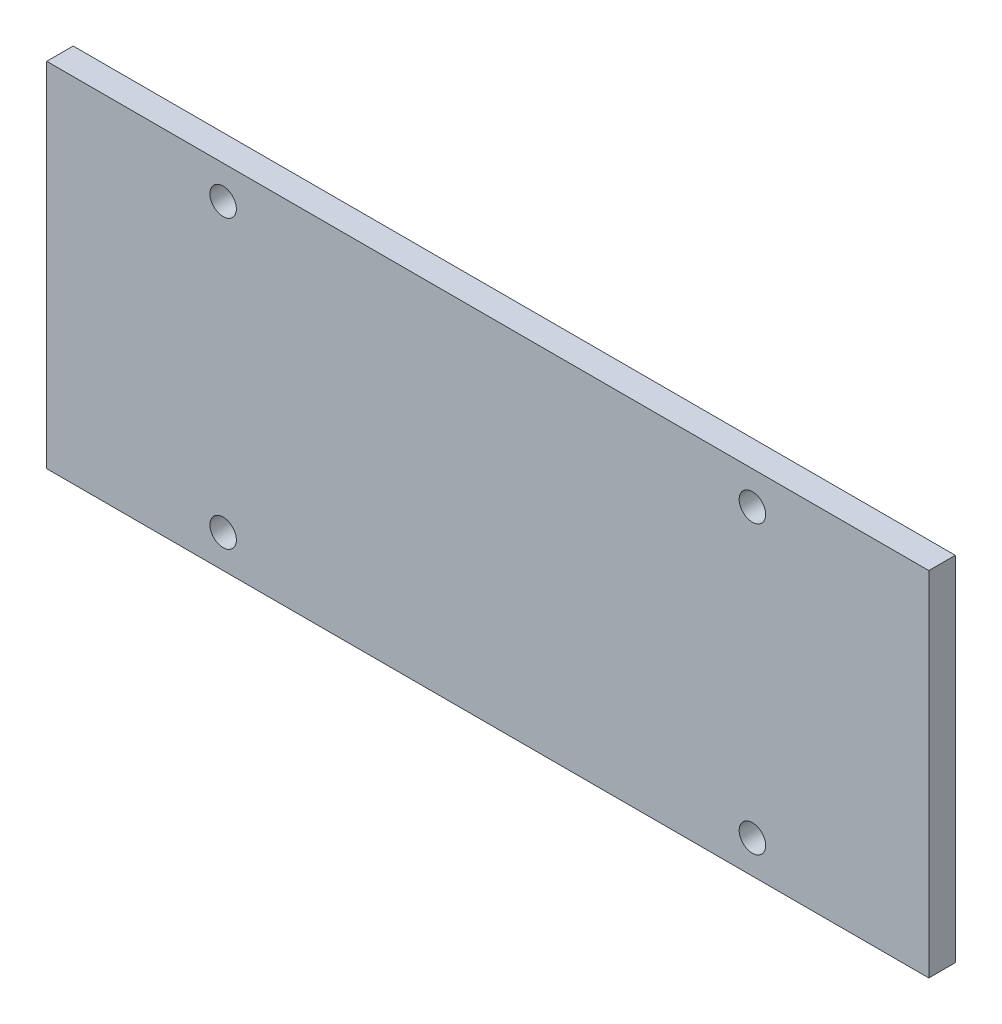
ISO-10303-21;
HEADER;
FILE_DESCRIPTION(('STEP AP214'),'2;1');
FILE_NAME('part.step','',(''),(''),'','','');
FILE_SCHEMA(('AUTOMOTIVE_DESIGN { 1 0 10303 214 1 1 1 1 }'));
ENDSEC;
DATA;
#1=APPLICATION_CONTEXT('core data for automotive mechanical design processes');
#2=APPLICATION_PROTOCOL_DEFINITION('international standard','automotive_design',2000,#1);
#3=PRODUCT_CONTEXT('',#1,'mechanical');
#4=PRODUCT('Part','Part','',(#3));
#5=PRODUCT_RELATED_PRODUCT_CATEGORY('part','',(#4));
#6=PRODUCT_DEFINITION_FORMATION('','',#4);
#7=PRODUCT_DEFINITION_CONTEXT('part definition',#1,'design');
#8=PRODUCT_DEFINITION('design','',#6,#7);
#9=PRODUCT_DEFINITION_SHAPE('','',#8);
#10=(LENGTH_UNIT() NAMED_UNIT(*) SI_UNIT(.MILLI.,.METRE.));
#11=(NAMED_UNIT(*) PLANE_ANGLE_UNIT() SI_UNIT($,.RADIAN.));
#12=(NAMED_UNIT(*) SI_UNIT($,.STERADIAN.) SOLID_ANGLE_UNIT());
#13=UNCERTAINTY_MEASURE_WITH_UNIT(LENGTH_MEASURE(1.E-05),#10,'distance_accuracy_value','');
#14=(GEOMETRIC_REPRESENTATION_CONTEXT(3) GLOBAL_UNCERTAINTY_ASSIGNED_CONTEXT((#13)) GLOBAL_UNIT_ASSIGNED_CONTEXT((#10,
#11,#12)) REPRESENTATION_CONTEXT('',''));
#15=CARTESIAN_POINT('',(0.,0.,0.));
#16=DIRECTION('',(0.,0.,1.));
#17=DIRECTION('',(1.,0.,0.));
#18=AXIS2_PLACEMENT_3D('',#15,#16,#17);
#19=CARTESIAN_POINT('',(0.,0.,3.));
#20=DIRECTION('',(0.,0.,1.));
#21=DIRECTION('',(1.,0.,0.));
#22=AXIS2_PLACEMENT_3D('',#19,#20,#21);
#23=PLANE('',#22);
#24=CARTESIAN_POINT('',(30.,-16.25,3.));
#25=DIRECTION('',(0.,0.,1.));
#26=DIRECTION('',(1.,0.,0.));
#27=AXIS2_PLACEMENT_3D('',#24,#25,#26);
#28=CIRCLE('',#27,1.5);
#29=CARTESIAN_POINT('',(31.5,-16.25,3.));
#30=VERTEX_POINT('',#29);
#31=EDGE_CURVE('E121',#30,#30,#28,.T.);
#32=ORIENTED_EDGE('',*,*,#31,.F.);
#33=EDGE_LOOP('',(#32));
#34=FACE_BOUND('',#33,.T.);
#35=CARTESIAN_POINT('',(-30.,16.25,3.));
#36=DIRECTION('',(0.,0.,1.));
#37=DIRECTION('',(1.,0.,0.));
#38=AXIS2_PLACEMENT_3D('',#35,#36,#37);
#39=CIRCLE('',#38,1.5);
#40=CARTESIAN_POINT('',(-28.5,16.25,3.));
#41=VERTEX_POINT('',#40);
#42=EDGE_CURVE('E100',#41,#41,#39,.T.);
#43=ORIENTED_EDGE('',*,*,#42,.F.);
#44=EDGE_LOOP('',(#43));
#45=FACE_BOUND('',#44,.T.);
#46=DIRECTION('',(0.,1.,0.));
#47=VECTOR('',#46,1.);
#48=CARTESIAN_POINT('',(50.,20.,3.));
#49=LINE('',#48,#47);
#50=CARTESIAN_POINT('',(50.,-20.,3.));
#51=VERTEX_POINT('',#50);
#52=CARTESIAN_POINT('',(50.,20.,3.));
#53=VERTEX_POINT('',#52);
#54=EDGE_CURVE('E85',#51,#53,#49,.T.);
#55=ORIENTED_EDGE('',*,*,#54,.T.);
#56=DIRECTION('',(-1.,0.,0.));
#57=VECTOR('',#56,1.);
#58=CARTESIAN_POINT('',(-50.,20.,3.));
#59=LINE('',#58,#57);
#60=CARTESIAN_POINT('',(-50.,20.,3.));
#61=VERTEX_POINT('',#60);
#62=EDGE_CURVE('E80',#53,#61,#59,.T.);
#63=ORIENTED_EDGE('',*,*,#62,.T.);
#64=DIRECTION('',(0.,-1.,0.));
#65=VECTOR('',#64,1.);
#66=CARTESIAN_POINT('',(-50.,20.,3.));
#67=LINE('',#66,#65);
#68=CARTESIAN_POINT('',(-50.,-20.,3.));
#69=VERTEX_POINT('',#68);
#70=EDGE_CURVE('E83',#61,#69,#67,.T.);
#71=ORIENTED_EDGE('',*,*,#70,.T.);
#72=DIRECTION('',(1.,0.,0.));
#73=VECTOR('',#72,1.);
#74=CARTESIAN_POINT('',(-50.,-20.,3.));
#75=LINE('',#74,#73);
#76=EDGE_CURVE('E50',#69,#51,#75,.T.);
#77=ORIENTED_EDGE('',*,*,#76,.T.);
#78=EDGE_LOOP('',(#55,#63,#71,#77));
#79=FACE_BOUND('',#78,.T.);
#80=CARTESIAN_POINT('',(30.,16.25,3.));
#81=DIRECTION('',(0.,0.,1.));
#82=DIRECTION('',(1.,0.,0.));
#83=AXIS2_PLACEMENT_3D('',#80,#81,#82);
#84=CIRCLE('',#83,1.5);
#85=CARTESIAN_POINT('',(31.5,16.25,3.));
#86=VERTEX_POINT('',#85);
#87=EDGE_CURVE('E115',#86,#86,#84,.T.);
#88=ORIENTED_EDGE('',*,*,#87,.F.);
#89=EDGE_LOOP('',(#88));
#90=FACE_BOUND('',#89,.T.);
#91=CARTESIAN_POINT('',(-30.,-16.25,3.));
#92=DIRECTION('',(0.,0.,1.));
#93=DIRECTION('',(1.,0.,0.));
#94=AXIS2_PLACEMENT_3D('',#91,#92,#93);
#95=CIRCLE('',#94,1.5);
#96=CARTESIAN_POINT('',(-28.5,-16.25,3.));
#97=VERTEX_POINT('',#96);
#98=EDGE_CURVE('E127',#97,#97,#95,.T.);
#99=ORIENTED_EDGE('',*,*,#98,.F.);
#100=EDGE_LOOP('',(#99));
#101=FACE_BOUND('',#100,.T.);
#102=ADVANCED_FACE('F33',(#34,#45,#79,#90,#101),#23,.T.);
#103=CARTESIAN_POINT('',(0.,0.,0.));
#104=DIRECTION('',(0.,0.,1.));
#105=DIRECTION('',(1.,0.,0.));
#106=AXIS2_PLACEMENT_3D('',#103,#104,#105);
#107=PLANE('',#106);
#108=CARTESIAN_POINT('',(30.,-16.25,0.));
#109=DIRECTION('',(0.,0.,1.));
#110=DIRECTION('',(1.,0.,0.));
#111=AXIS2_PLACEMENT_3D('',#108,#109,#110);
#112=CIRCLE('',#111,1.5);
#113=CARTESIAN_POINT('',(31.5,-16.25,0.));
#114=VERTEX_POINT('',#113);
#115=EDGE_CURVE('E124',#114,#114,#112,.T.);
#116=ORIENTED_EDGE('',*,*,#115,.T.);
#117=EDGE_LOOP('',(#116));
#118=FACE_BOUND('',#117,.T.);
#119=CARTESIAN_POINT('',(-30.,16.25,0.));
#120=DIRECTION('',(0.,0.,1.));
#121=DIRECTION('',(1.,0.,0.));
#122=AXIS2_PLACEMENT_3D('',#119,#120,#121);
#123=CIRCLE('',#122,1.5);
#124=CARTESIAN_POINT('',(-28.5,16.25,0.));
#125=VERTEX_POINT('',#124);
#126=EDGE_CURVE('E112',#125,#125,#123,.T.);
#127=ORIENTED_EDGE('',*,*,#126,.T.);
#128=EDGE_LOOP('',(#127));
#129=FACE_BOUND('',#128,.T.);
#130=DIRECTION('',(0.,1.,0.));
#131=VECTOR('',#130,1.);
#132=CARTESIAN_POINT('',(50.,20.,0.));
#133=LINE('',#132,#131);
#134=CARTESIAN_POINT('',(50.,-20.,0.));
#135=VERTEX_POINT('',#134);
#136=CARTESIAN_POINT('',(50.,20.,0.));
#137=VERTEX_POINT('',#136);
#138=EDGE_CURVE('E97',#135,#137,#133,.T.);
#139=ORIENTED_EDGE('',*,*,#138,.F.);
#140=DIRECTION('',(1.,0.,0.));
#141=VECTOR('',#140,1.);
#142=CARTESIAN_POINT('',(-50.,-20.,0.));
#143=LINE('',#142,#141);
#144=CARTESIAN_POINT('',(-50.,-20.,0.));
#145=VERTEX_POINT('',#144);
#146=EDGE_CURVE('E73',#145,#135,#143,.T.);
#147=ORIENTED_EDGE('',*,*,#146,.F.);
#148=DIRECTION('',(0.,-1.,0.));
#149=VECTOR('',#148,1.);
#150=CARTESIAN_POINT('',(-50.,20.,0.));
#151=LINE('',#150,#149);
#152=CARTESIAN_POINT('',(-50.,20.,0.));
#153=VERTEX_POINT('',#152);
#154=EDGE_CURVE('E67',#153,#145,#151,.T.);
#155=ORIENTED_EDGE('',*,*,#154,.F.);
#156=DIRECTION('',(-1.,0.,0.));
#157=VECTOR('',#156,1.);
#158=CARTESIAN_POINT('',(-50.,20.,0.));
#159=LINE('',#158,#157);
#160=EDGE_CURVE('E89',#137,#153,#159,.T.);
#161=ORIENTED_EDGE('',*,*,#160,.F.);
#162=EDGE_LOOP('',(#139,#147,#155,#161));
#163=FACE_BOUND('',#162,.T.);
#164=CARTESIAN_POINT('',(30.,16.25,0.));
#165=DIRECTION('',(0.,0.,1.));
#166=DIRECTION('',(1.,0.,0.));
#167=AXIS2_PLACEMENT_3D('',#164,#165,#166);
#168=CIRCLE('',#167,1.5);
#169=CARTESIAN_POINT('',(31.5,16.25,0.));
#170=VERTEX_POINT('',#169);
#171=EDGE_CURVE('E118',#170,#170,#168,.T.);
#172=ORIENTED_EDGE('',*,*,#171,.T.);
#173=EDGE_LOOP('',(#172));
#174=FACE_BOUND('',#173,.T.);
#175=CARTESIAN_POINT('',(-30.,-16.25,0.));
#176=DIRECTION('',(0.,0.,1.));
#177=DIRECTION('',(1.,0.,0.));
#178=AXIS2_PLACEMENT_3D('',#175,#176,#177);
#179=CIRCLE('',#178,1.5);
#180=CARTESIAN_POINT('',(-28.5,-16.25,0.));
#181=VERTEX_POINT('',#180);
#182=EDGE_CURVE('E130',#181,#181,#179,.T.);
#183=ORIENTED_EDGE('',*,*,#182,.T.);
#184=EDGE_LOOP('',(#183));
#185=FACE_BOUND('',#184,.T.);
#186=ADVANCED_FACE('F108',(#118,#129,#163,#174,#185),#107,.F.);
#187=CARTESIAN_POINT('',(50.,20.,3.));
#188=DIRECTION('',(-1.,0.,0.));
#189=DIRECTION('',(0.,0.,1.));
#190=AXIS2_PLACEMENT_3D('',#187,#188,#189);
#191=PLANE('',#190);
#192=ORIENTED_EDGE('',*,*,#138,.T.);
#193=DIRECTION('',(0.,0.,-1.));
#194=VECTOR('',#193,1.);
#195=CARTESIAN_POINT('',(50.,20.,3.));
#196=LINE('',#195,#194);
#197=EDGE_CURVE('E11',#53,#137,#196,.T.);
#198=ORIENTED_EDGE('',*,*,#197,.F.);
#199=ORIENTED_EDGE('',*,*,#54,.F.);
#200=DIRECTION('',(0.,0.,-1.));
#201=VECTOR('',#200,1.);
#202=CARTESIAN_POINT('',(50.,-20.,3.));
#203=LINE('',#202,#201);
#204=EDGE_CURVE('E93',#51,#135,#203,.T.);
#205=ORIENTED_EDGE('',*,*,#204,.T.);
#206=EDGE_LOOP('',(#192,#198,#199,#205));
#207=FACE_BOUND('',#206,.T.);
#208=ADVANCED_FACE('F35',(#207),#191,.F.);
#209=CARTESIAN_POINT('',(-50.,20.,3.));
#210=DIRECTION('',(0.,-1.,0.));
#211=DIRECTION('',(0.,0.,-1.));
#212=AXIS2_PLACEMENT_3D('',#209,#210,#211);
#213=PLANE('',#212);
#214=ORIENTED_EDGE('',*,*,#160,.T.);
#215=DIRECTION('',(0.,0.,-1.));
#216=VECTOR('',#215,1.);
#217=CARTESIAN_POINT('',(-50.,20.,3.));
#218=LINE('',#217,#216);
#219=EDGE_CURVE('E42',#61,#153,#218,.T.);
#220=ORIENTED_EDGE('',*,*,#219,.F.);
#221=ORIENTED_EDGE('',*,*,#62,.F.);
#222=ORIENTED_EDGE('',*,*,#197,.T.);
#223=EDGE_LOOP('',(#214,#220,#221,#222));
#224=FACE_BOUND('',#223,.T.);
#225=ADVANCED_FACE('F88',(#224),#213,.F.);
#226=CARTESIAN_POINT('',(-50.,20.,3.));
#227=DIRECTION('',(1.,0.,0.));
#228=DIRECTION('',(0.,0.,-1.));
#229=AXIS2_PLACEMENT_3D('',#226,#227,#228);
#230=PLANE('',#229);
#231=ORIENTED_EDGE('',*,*,#154,.T.);
#232=DIRECTION('',(0.,0.,-1.));
#233=VECTOR('',#232,1.);
#234=CARTESIAN_POINT('',(-50.,-20.,3.));
#235=LINE('',#234,#233);
#236=EDGE_CURVE('E90',#69,#145,#235,.T.);
#237=ORIENTED_EDGE('',*,*,#236,.F.);
#238=ORIENTED_EDGE('',*,*,#70,.F.);
#239=ORIENTED_EDGE('',*,*,#219,.T.);
#240=EDGE_LOOP('',(#231,#237,#238,#239));
#241=FACE_BOUND('',#240,.T.);
#242=ADVANCED_FACE('F91',(#241),#230,.F.);
#243=CARTESIAN_POINT('',(-50.,-20.,3.));
#244=DIRECTION('',(0.,1.,0.));
#245=DIRECTION('',(0.,0.,1.));
#246=AXIS2_PLACEMENT_3D('',#243,#244,#245);
#247=PLANE('',#246);
#248=ORIENTED_EDGE('',*,*,#146,.T.);
#249=ORIENTED_EDGE('',*,*,#204,.F.);
#250=ORIENTED_EDGE('',*,*,#76,.F.);
#251=ORIENTED_EDGE('',*,*,#236,.T.);
#252=EDGE_LOOP('',(#248,#249,#250,#251));
#253=FACE_BOUND('',#252,.T.);
#254=ADVANCED_FACE('F105',(#253),#247,.F.);
#255=CARTESIAN_POINT('',(-30.,16.25,3.));
#256=DIRECTION('',(0.,0.,-1.));
#257=DIRECTION('',(-1.,0.,0.));
#258=AXIS2_PLACEMENT_3D('',#255,#256,#257);
#259=CYLINDRICAL_SURFACE('',#258,1.5);
#260=ORIENTED_EDGE('',*,*,#42,.T.);
#261=EDGE_LOOP('',(#260));
#262=FACE_BOUND('',#261,.T.);
#263=ORIENTED_EDGE('',*,*,#126,.F.);
#264=EDGE_LOOP('',(#263));
#265=FACE_BOUND('',#264,.T.);
#266=ADVANCED_FACE('F150',(#262,#265),#259,.F.);
#267=CARTESIAN_POINT('',(30.,16.25,3.));
#268=DIRECTION('',(0.,0.,-1.));
#269=DIRECTION('',(-1.,0.,0.));
#270=AXIS2_PLACEMENT_3D('',#267,#268,#269);
#271=CYLINDRICAL_SURFACE('',#270,1.5);
#272=ORIENTED_EDGE('',*,*,#87,.T.);
#273=EDGE_LOOP('',(#272));
#274=FACE_BOUND('',#273,.T.);
#275=ORIENTED_EDGE('',*,*,#171,.F.);
#276=EDGE_LOOP('',(#275));
#277=FACE_BOUND('',#276,.T.);
#278=ADVANCED_FACE('F196',(#274,#277),#271,.F.);
#279=CARTESIAN_POINT('',(30.,-16.25,3.));
#280=DIRECTION('',(0.,0.,-1.));
#281=DIRECTION('',(-1.,0.,0.));
#282=AXIS2_PLACEMENT_3D('',#279,#280,#281);
#283=CYLINDRICAL_SURFACE('',#282,1.5);
#284=ORIENTED_EDGE('',*,*,#31,.T.);
#285=EDGE_LOOP('',(#284));
#286=FACE_BOUND('',#285,.T.);
#287=ORIENTED_EDGE('',*,*,#115,.F.);
#288=EDGE_LOOP('',(#287));
#289=FACE_BOUND('',#288,.T.);
#290=ADVANCED_FACE('F204',(#286,#289),#283,.F.);
#291=CARTESIAN_POINT('',(-30.,-16.25,3.));
#292=DIRECTION('',(0.,0.,-1.));
#293=DIRECTION('',(-1.,0.,0.));
#294=AXIS2_PLACEMENT_3D('',#291,#292,#293);
#295=CYLINDRICAL_SURFACE('',#294,1.5);
#296=ORIENTED_EDGE('',*,*,#98,.T.);
#297=EDGE_LOOP('',(#296));
#298=FACE_BOUND('',#297,.T.);
#299=ORIENTED_EDGE('',*,*,#182,.F.);
#300=EDGE_LOOP('',(#299));
#301=FACE_BOUND('',#300,.T.);
#302=ADVANCED_FACE('F136',(#298,#301),#295,.F.);
#303=CLOSED_SHELL('',(#102,#186,#208,#225,#242,#254,#266,#278,#290,#302));
#304=MANIFOLD_SOLID_BREP('B2',#303);
#305=ADVANCED_BREP_SHAPE_REPRESENTATION('',(#18,#304),#14);
#306=SHAPE_DEFINITION_REPRESENTATION(#9,#305);
ENDSEC;
END-ISO-10303-21;
